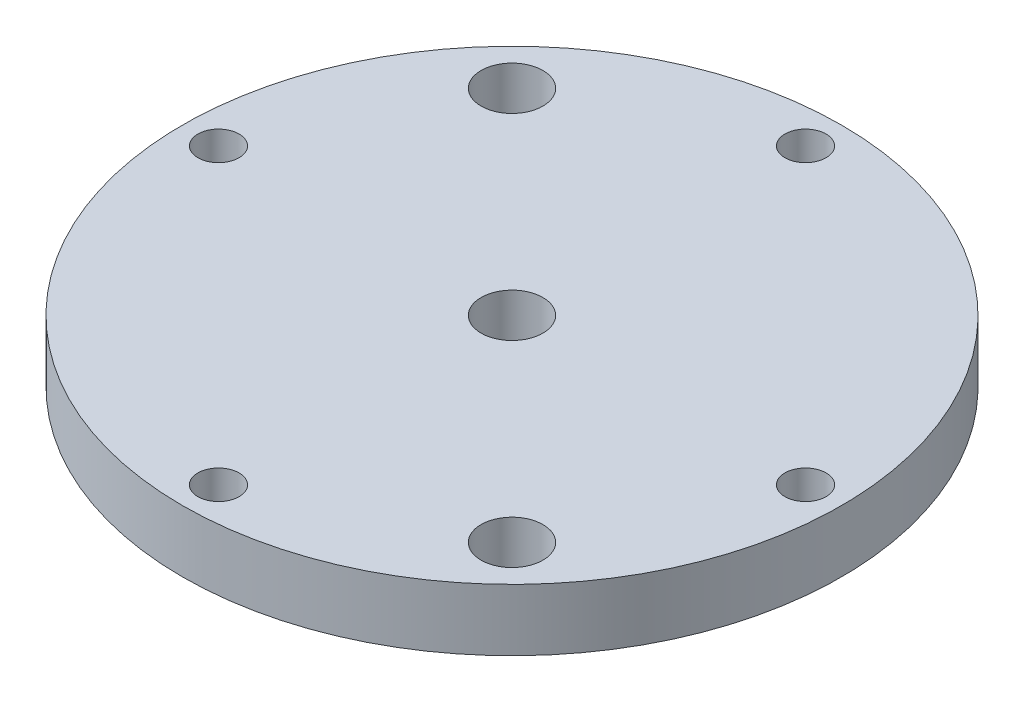
ISO-10303-21;
HEADER;
FILE_DESCRIPTION(('STEP AP214'),'2;1');
FILE_NAME('part.step','',(''),(''),'','','');
FILE_SCHEMA(('AUTOMOTIVE_DESIGN { 1 0 10303 214 1 1 1 1 }'));
ENDSEC;
DATA;
#1=APPLICATION_CONTEXT('core data for automotive mechanical design processes');
#2=APPLICATION_PROTOCOL_DEFINITION('international standard','automotive_design',2000,#1);
#3=PRODUCT_CONTEXT('',#1,'mechanical');
#4=PRODUCT('Part','Part','',(#3));
#5=PRODUCT_RELATED_PRODUCT_CATEGORY('part','',(#4));
#6=PRODUCT_DEFINITION_FORMATION('','',#4);
#7=PRODUCT_DEFINITION_CONTEXT('part definition',#1,'design');
#8=PRODUCT_DEFINITION('design','',#6,#7);
#9=PRODUCT_DEFINITION_SHAPE('','',#8);
#10=(LENGTH_UNIT() NAMED_UNIT(*) SI_UNIT(.MILLI.,.METRE.));
#11=(NAMED_UNIT(*) PLANE_ANGLE_UNIT() SI_UNIT($,.RADIAN.));
#12=(NAMED_UNIT(*) SI_UNIT($,.STERADIAN.) SOLID_ANGLE_UNIT());
#13=UNCERTAINTY_MEASURE_WITH_UNIT(LENGTH_MEASURE(1.E-05),#10,'distance_accuracy_value','');
#14=(GEOMETRIC_REPRESENTATION_CONTEXT(3) GLOBAL_UNCERTAINTY_ASSIGNED_CONTEXT((#13)) GLOBAL_UNIT_ASSIGNED_CONTEXT((#10,
#11,#12)) REPRESENTATION_CONTEXT('',''));
#15=CARTESIAN_POINT('',(0.,0.,0.));
#16=DIRECTION('',(0.,0.,1.));
#17=DIRECTION('',(1.,0.,0.));
#18=AXIS2_PLACEMENT_3D('',#15,#16,#17);
#19=CARTESIAN_POINT('',(0.,6.,0.));
#20=DIRECTION('',(0.,1.,0.));
#21=DIRECTION('',(0.,0.,1.));
#22=AXIS2_PLACEMENT_3D('',#19,#20,#21);
#23=PLANE('',#22);
#24=CARTESIAN_POINT('',(-28.5,6.,1.52849875866222E-12));
#25=DIRECTION('',(0.,1.,0.));
#26=DIRECTION('',(0.,0.,1.));
#27=AXIS2_PLACEMENT_3D('',#24,#25,#26);
#28=CIRCLE('',#27,2.);
#29=CARTESIAN_POINT('',(-28.5,6.,2.00000000000153));
#30=VERTEX_POINT('',#29);
#31=EDGE_CURVE('E71',#30,#30,#28,.T.);
#32=ORIENTED_EDGE('',*,*,#31,.F.);
#33=EDGE_LOOP('',(#32));
#34=FACE_BOUND('',#33,.T.);
#35=CARTESIAN_POINT('',(28.5,6.,-1.66875543188837E-12));
#36=DIRECTION('',(0.,1.,0.));
#37=DIRECTION('',(0.,0.,1.));
#38=AXIS2_PLACEMENT_3D('',#35,#36,#37);
#39=CIRCLE('',#38,2.);
#40=CARTESIAN_POINT('',(28.5,6.,1.99999999999833));
#41=VERTEX_POINT('',#40);
#42=EDGE_CURVE('E59',#41,#41,#39,.T.);
#43=ORIENTED_EDGE('',*,*,#42,.F.);
#44=EDGE_LOOP('',(#43));
#45=FACE_BOUND('',#44,.T.);
#46=CARTESIAN_POINT('',(0.,6.,-28.5));
#47=DIRECTION('',(0.,1.,0.));
#48=DIRECTION('',(0.,0.,1.));
#49=AXIS2_PLACEMENT_3D('',#46,#47,#48);
#50=CIRCLE('',#49,2.);
#51=CARTESIAN_POINT('',(0.,6.,-26.5));
#52=VERTEX_POINT('',#51);
#53=EDGE_CURVE('E47',#52,#52,#50,.T.);
#54=ORIENTED_EDGE('',*,*,#53,.F.);
#55=EDGE_LOOP('',(#54));
#56=FACE_BOUND('',#55,.T.);
#57=CARTESIAN_POINT('',(0.,6.,0.));
#58=DIRECTION('',(0.,1.,0.));
#59=DIRECTION('',(0.,0.,1.));
#60=AXIS2_PLACEMENT_3D('',#57,#58,#59);
#61=CIRCLE('',#60,32.);
#62=CARTESIAN_POINT('',(0.,6.,32.));
#63=VERTEX_POINT('',#62);
#64=EDGE_CURVE('E10',#63,#63,#61,.T.);
#65=ORIENTED_EDGE('',*,*,#64,.T.);
#66=EDGE_LOOP('',(#65));
#67=FACE_BOUND('',#66,.T.);
#68=CARTESIAN_POINT('',(0.,6.,0.));
#69=DIRECTION('',(0.,1.,0.));
#70=DIRECTION('',(0.,0.,1.));
#71=AXIS2_PLACEMENT_3D('',#68,#69,#70);
#72=CIRCLE('',#71,3.);
#73=CARTESIAN_POINT('',(0.,6.,3.));
#74=VERTEX_POINT('',#73);
#75=EDGE_CURVE('E42',#74,#74,#72,.T.);
#76=ORIENTED_EDGE('',*,*,#75,.F.);
#77=EDGE_LOOP('',(#76));
#78=FACE_BOUND('',#77,.T.);
#79=CARTESIAN_POINT('',(-19.0918830920368,6.,-19.0918830920367));
#80=DIRECTION('',(0.,1.,0.));
#81=DIRECTION('',(0.,0.,1.));
#82=AXIS2_PLACEMENT_3D('',#79,#80,#81);
#83=CIRCLE('',#82,3.);
#84=CARTESIAN_POINT('',(-19.0918830920368,6.,-16.0918830920367));
#85=VERTEX_POINT('',#84);
#86=EDGE_CURVE('E53',#85,#85,#83,.T.);
#87=ORIENTED_EDGE('',*,*,#86,.F.);
#88=EDGE_LOOP('',(#87));
#89=FACE_BOUND('',#88,.T.);
#90=CARTESIAN_POINT('',(3.25027769767715E-12,6.,28.5));
#91=DIRECTION('',(0.,1.,0.));
#92=DIRECTION('',(0.,0.,1.));
#93=AXIS2_PLACEMENT_3D('',#90,#91,#92);
#94=CIRCLE('',#93,2.);
#95=CARTESIAN_POINT('',(3.25027769767715E-12,6.,30.5));
#96=VERTEX_POINT('',#95);
#97=EDGE_CURVE('E65',#96,#96,#94,.T.);
#98=ORIENTED_EDGE('',*,*,#97,.F.);
#99=EDGE_LOOP('',(#98));
#100=FACE_BOUND('',#99,.T.);
#101=CARTESIAN_POINT('',(19.0918830920378,6.,19.0918830920357));
#102=DIRECTION('',(0.,1.,0.));
#103=DIRECTION('',(0.,0.,1.));
#104=AXIS2_PLACEMENT_3D('',#101,#102,#103);
#105=CIRCLE('',#104,2.99999999999998);
#106=CARTESIAN_POINT('',(19.0918830920378,6.,22.0918830920357));
#107=VERTEX_POINT('',#106);
#108=EDGE_CURVE('E77',#107,#107,#105,.T.);
#109=ORIENTED_EDGE('',*,*,#108,.F.);
#110=EDGE_LOOP('',(#109));
#111=FACE_BOUND('',#110,.T.);
#112=ADVANCED_FACE('F31',(#34,#45,#56,#67,#78,#89,#100,#111),#23,.T.);
#113=CARTESIAN_POINT('',(0.,0.,0.));
#114=DIRECTION('',(0.,1.,0.));
#115=DIRECTION('',(0.,0.,1.));
#116=AXIS2_PLACEMENT_3D('',#113,#114,#115);
#117=PLANE('',#116);
#118=CARTESIAN_POINT('',(0.,0.,0.));
#119=DIRECTION('',(0.,1.,0.));
#120=DIRECTION('',(0.,0.,1.));
#121=AXIS2_PLACEMENT_3D('',#118,#119,#120);
#122=CIRCLE('',#121,32.);
#123=CARTESIAN_POINT('',(0.,0.,32.));
#124=VERTEX_POINT('',#123);
#125=EDGE_CURVE('E35',#124,#124,#122,.T.);
#126=ORIENTED_EDGE('',*,*,#125,.F.);
#127=EDGE_LOOP('',(#126));
#128=FACE_BOUND('',#127,.T.);
#129=CARTESIAN_POINT('',(0.,0.,0.));
#130=DIRECTION('',(0.,1.,0.));
#131=DIRECTION('',(0.,0.,1.));
#132=AXIS2_PLACEMENT_3D('',#129,#130,#131);
#133=CIRCLE('',#132,3.);
#134=CARTESIAN_POINT('',(0.,0.,3.));
#135=VERTEX_POINT('',#134);
#136=EDGE_CURVE('E44',#135,#135,#133,.T.);
#137=ORIENTED_EDGE('',*,*,#136,.T.);
#138=EDGE_LOOP('',(#137));
#139=FACE_BOUND('',#138,.T.);
#140=CARTESIAN_POINT('',(0.,0.,-28.5));
#141=DIRECTION('',(0.,1.,0.));
#142=DIRECTION('',(0.,0.,1.));
#143=AXIS2_PLACEMENT_3D('',#140,#141,#142);
#144=CIRCLE('',#143,2.);
#145=CARTESIAN_POINT('',(0.,0.,-26.5));
#146=VERTEX_POINT('',#145);
#147=EDGE_CURVE('E50',#146,#146,#144,.T.);
#148=ORIENTED_EDGE('',*,*,#147,.T.);
#149=EDGE_LOOP('',(#148));
#150=FACE_BOUND('',#149,.T.);
#151=CARTESIAN_POINT('',(-19.0918830920368,0.,-19.0918830920367));
#152=DIRECTION('',(0.,1.,0.));
#153=DIRECTION('',(0.,0.,1.));
#154=AXIS2_PLACEMENT_3D('',#151,#152,#153);
#155=CIRCLE('',#154,3.);
#156=CARTESIAN_POINT('',(-19.0918830920368,0.,-16.0918830920367));
#157=VERTEX_POINT('',#156);
#158=EDGE_CURVE('E56',#157,#157,#155,.T.);
#159=ORIENTED_EDGE('',*,*,#158,.T.);
#160=EDGE_LOOP('',(#159));
#161=FACE_BOUND('',#160,.T.);
#162=CARTESIAN_POINT('',(28.5,0.,-1.66875543188837E-12));
#163=DIRECTION('',(0.,1.,0.));
#164=DIRECTION('',(0.,0.,1.));
#165=AXIS2_PLACEMENT_3D('',#162,#163,#164);
#166=CIRCLE('',#165,2.);
#167=CARTESIAN_POINT('',(28.5,0.,1.99999999999833));
#168=VERTEX_POINT('',#167);
#169=EDGE_CURVE('E62',#168,#168,#166,.T.);
#170=ORIENTED_EDGE('',*,*,#169,.T.);
#171=EDGE_LOOP('',(#170));
#172=FACE_BOUND('',#171,.T.);
#173=CARTESIAN_POINT('',(3.25027769767715E-12,0.,28.5));
#174=DIRECTION('',(0.,1.,0.));
#175=DIRECTION('',(0.,0.,1.));
#176=AXIS2_PLACEMENT_3D('',#173,#174,#175);
#177=CIRCLE('',#176,2.);
#178=CARTESIAN_POINT('',(3.25027769767715E-12,0.,30.5));
#179=VERTEX_POINT('',#178);
#180=EDGE_CURVE('E68',#179,#179,#177,.T.);
#181=ORIENTED_EDGE('',*,*,#180,.T.);
#182=EDGE_LOOP('',(#181));
#183=FACE_BOUND('',#182,.T.);
#184=CARTESIAN_POINT('',(-28.5,0.,1.52849875866222E-12));
#185=DIRECTION('',(0.,1.,0.));
#186=DIRECTION('',(0.,0.,1.));
#187=AXIS2_PLACEMENT_3D('',#184,#185,#186);
#188=CIRCLE('',#187,2.);
#189=CARTESIAN_POINT('',(-28.5,0.,2.00000000000153));
#190=VERTEX_POINT('',#189);
#191=EDGE_CURVE('E74',#190,#190,#188,.T.);
#192=ORIENTED_EDGE('',*,*,#191,.T.);
#193=EDGE_LOOP('',(#192));
#194=FACE_BOUND('',#193,.T.);
#195=CARTESIAN_POINT('',(19.0918830920378,0.,19.0918830920357));
#196=DIRECTION('',(0.,1.,0.));
#197=DIRECTION('',(0.,0.,1.));
#198=AXIS2_PLACEMENT_3D('',#195,#196,#197);
#199=CIRCLE('',#198,2.99999999999998);
#200=CARTESIAN_POINT('',(19.0918830920378,0.,22.0918830920357));
#201=VERTEX_POINT('',#200);
#202=EDGE_CURVE('E80',#201,#201,#199,.T.);
#203=ORIENTED_EDGE('',*,*,#202,.T.);
#204=EDGE_LOOP('',(#203));
#205=FACE_BOUND('',#204,.T.);
#206=ADVANCED_FACE('F90',(#128,#139,#150,#161,#172,#183,#194,#205),#117,.F.);
#207=CARTESIAN_POINT('',(0.,6.,0.));
#208=DIRECTION('',(0.,-1.,0.));
#209=DIRECTION('',(0.,0.,-1.));
#210=AXIS2_PLACEMENT_3D('',#207,#208,#209);
#211=CYLINDRICAL_SURFACE('',#210,32.);
#212=ORIENTED_EDGE('',*,*,#64,.F.);
#213=EDGE_LOOP('',(#212));
#214=FACE_BOUND('',#213,.T.);
#215=ORIENTED_EDGE('',*,*,#125,.T.);
#216=EDGE_LOOP('',(#215));
#217=FACE_BOUND('',#216,.T.);
#218=ADVANCED_FACE('F33',(#214,#217),#211,.T.);
#219=CARTESIAN_POINT('',(0.,6.,0.));
#220=DIRECTION('',(0.,-1.,0.));
#221=DIRECTION('',(0.,0.,-1.));
#222=AXIS2_PLACEMENT_3D('',#219,#220,#221);
#223=CYLINDRICAL_SURFACE('',#222,3.);
#224=ORIENTED_EDGE('',*,*,#75,.T.);
#225=EDGE_LOOP('',(#224));
#226=FACE_BOUND('',#225,.T.);
#227=ORIENTED_EDGE('',*,*,#136,.F.);
#228=EDGE_LOOP('',(#227));
#229=FACE_BOUND('',#228,.T.);
#230=ADVANCED_FACE('F100',(#226,#229),#223,.F.);
#231=CARTESIAN_POINT('',(0.,6.,-28.5));
#232=DIRECTION('',(0.,-1.,0.));
#233=DIRECTION('',(0.,0.,-1.));
#234=AXIS2_PLACEMENT_3D('',#231,#232,#233);
#235=CYLINDRICAL_SURFACE('',#234,2.);
#236=ORIENTED_EDGE('',*,*,#53,.T.);
#237=EDGE_LOOP('',(#236));
#238=FACE_BOUND('',#237,.T.);
#239=ORIENTED_EDGE('',*,*,#147,.F.);
#240=EDGE_LOOP('',(#239));
#241=FACE_BOUND('',#240,.T.);
#242=ADVANCED_FACE('F103',(#238,#241),#235,.F.);
#243=CARTESIAN_POINT('',(-19.0918830920368,6.,-19.0918830920367));
#244=DIRECTION('',(0.,-1.,0.));
#245=DIRECTION('',(0.,0.,-1.));
#246=AXIS2_PLACEMENT_3D('',#243,#244,#245);
#247=CYLINDRICAL_SURFACE('',#246,3.);
#248=ORIENTED_EDGE('',*,*,#86,.T.);
#249=EDGE_LOOP('',(#248));
#250=FACE_BOUND('',#249,.T.);
#251=ORIENTED_EDGE('',*,*,#158,.F.);
#252=EDGE_LOOP('',(#251));
#253=FACE_BOUND('',#252,.T.);
#254=ADVANCED_FACE('F107',(#250,#253),#247,.F.);
#255=CARTESIAN_POINT('',(28.5,6.,-1.66875543188837E-12));
#256=DIRECTION('',(0.,-1.,0.));
#257=DIRECTION('',(0.,0.,-1.));
#258=AXIS2_PLACEMENT_3D('',#255,#256,#257);
#259=CYLINDRICAL_SURFACE('',#258,2.);
#260=ORIENTED_EDGE('',*,*,#42,.T.);
#261=EDGE_LOOP('',(#260));
#262=FACE_BOUND('',#261,.T.);
#263=ORIENTED_EDGE('',*,*,#169,.F.);
#264=EDGE_LOOP('',(#263));
#265=FACE_BOUND('',#264,.T.);
#266=ADVANCED_FACE('F111',(#262,#265),#259,.F.);
#267=CARTESIAN_POINT('',(3.25027769767715E-12,6.,28.5));
#268=DIRECTION('',(0.,-1.,0.));
#269=DIRECTION('',(0.,0.,-1.));
#270=AXIS2_PLACEMENT_3D('',#267,#268,#269);
#271=CYLINDRICAL_SURFACE('',#270,2.);
#272=ORIENTED_EDGE('',*,*,#97,.T.);
#273=EDGE_LOOP('',(#272));
#274=FACE_BOUND('',#273,.T.);
#275=ORIENTED_EDGE('',*,*,#180,.F.);
#276=EDGE_LOOP('',(#275));
#277=FACE_BOUND('',#276,.T.);
#278=ADVANCED_FACE('F115',(#274,#277),#271,.F.);
#279=CARTESIAN_POINT('',(-28.5,6.,1.52849875866222E-12));
#280=DIRECTION('',(0.,-1.,0.));
#281=DIRECTION('',(0.,0.,-1.));
#282=AXIS2_PLACEMENT_3D('',#279,#280,#281);
#283=CYLINDRICAL_SURFACE('',#282,2.);
#284=ORIENTED_EDGE('',*,*,#31,.T.);
#285=EDGE_LOOP('',(#284));
#286=FACE_BOUND('',#285,.T.);
#287=ORIENTED_EDGE('',*,*,#191,.F.);
#288=EDGE_LOOP('',(#287));
#289=FACE_BOUND('',#288,.T.);
#290=ADVANCED_FACE('F119',(#286,#289),#283,.F.);
#291=CARTESIAN_POINT('',(19.0918830920378,6.,19.0918830920357));
#292=DIRECTION('',(0.,-1.,0.));
#293=DIRECTION('',(0.,0.,-1.));
#294=AXIS2_PLACEMENT_3D('',#291,#292,#293);
#295=CYLINDRICAL_SURFACE('',#294,2.99999999999998);
#296=ORIENTED_EDGE('',*,*,#108,.T.);
#297=EDGE_LOOP('',(#296));
#298=FACE_BOUND('',#297,.T.);
#299=ORIENTED_EDGE('',*,*,#202,.F.);
#300=EDGE_LOOP('',(#299));
#301=FACE_BOUND('',#300,.T.);
#302=ADVANCED_FACE('F86',(#298,#301),#295,.F.);
#303=CLOSED_SHELL('',(#112,#206,#218,#230,#242,#254,#266,#278,#290,#302));
#304=MANIFOLD_SOLID_BREP('B2',#303);
#305=ADVANCED_BREP_SHAPE_REPRESENTATION('',(#18,#304),#14);
#306=SHAPE_DEFINITION_REPRESENTATION(#9,#305);
ENDSEC;
END-ISO-10303-21;
